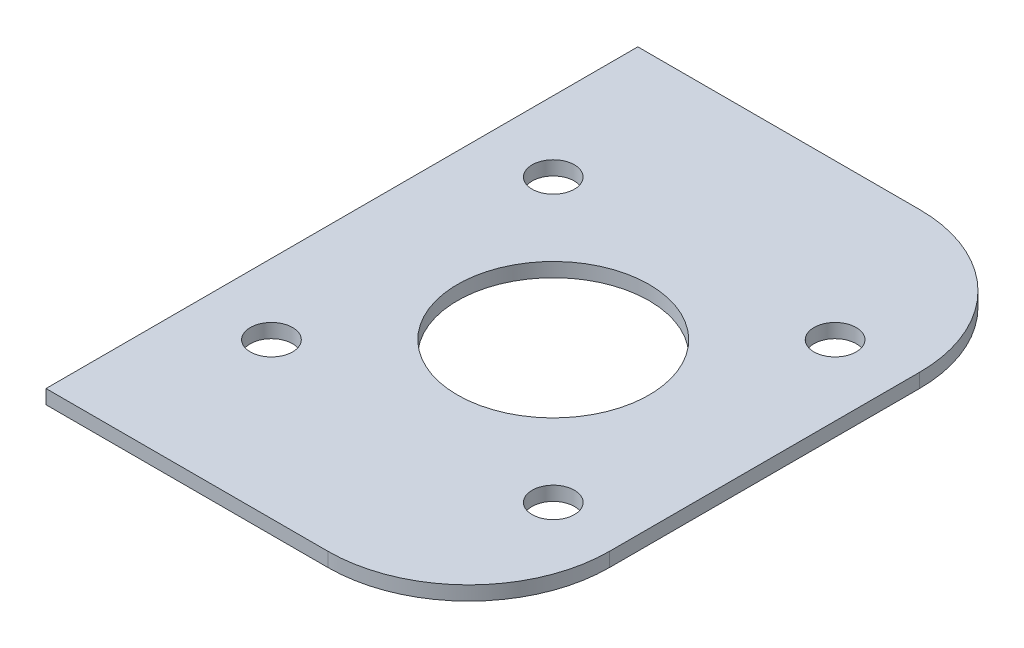
ISO-10303-21;
HEADER;
FILE_DESCRIPTION(('STEP AP214'),'2;1');
FILE_NAME('part.step','',(''),(''),'','','');
FILE_SCHEMA(('AUTOMOTIVE_DESIGN { 1 0 10303 214 1 1 1 1 }'));
ENDSEC;
DATA;
#1=APPLICATION_CONTEXT('core data for automotive mechanical design processes');
#2=APPLICATION_PROTOCOL_DEFINITION('international standard','automotive_design',2000,#1);
#3=PRODUCT_CONTEXT('',#1,'mechanical');
#4=PRODUCT('Part','Part','',(#3));
#5=PRODUCT_RELATED_PRODUCT_CATEGORY('part','',(#4));
#6=PRODUCT_DEFINITION_FORMATION('','',#4);
#7=PRODUCT_DEFINITION_CONTEXT('part definition',#1,'design');
#8=PRODUCT_DEFINITION('design','',#6,#7);
#9=PRODUCT_DEFINITION_SHAPE('','',#8);
#10=(LENGTH_UNIT() NAMED_UNIT(*) SI_UNIT(.MILLI.,.METRE.));
#11=(NAMED_UNIT(*) PLANE_ANGLE_UNIT() SI_UNIT($,.RADIAN.));
#12=(NAMED_UNIT(*) SI_UNIT($,.STERADIAN.) SOLID_ANGLE_UNIT());
#13=UNCERTAINTY_MEASURE_WITH_UNIT(LENGTH_MEASURE(1.E-05),#10,'distance_accuracy_value','');
#14=(GEOMETRIC_REPRESENTATION_CONTEXT(3) GLOBAL_UNCERTAINTY_ASSIGNED_CONTEXT((#13)) GLOBAL_UNIT_ASSIGNED_CONTEXT((#10,
#11,#12)) REPRESENTATION_CONTEXT('',''));
#15=CARTESIAN_POINT('',(0.,0.,0.));
#16=DIRECTION('',(0.,0.,1.));
#17=DIRECTION('',(1.,0.,0.));
#18=AXIS2_PLACEMENT_3D('',#15,#16,#17);
#19=CARTESIAN_POINT('',(0.,1.,0.));
#20=DIRECTION('',(0.,1.,0.));
#21=DIRECTION('',(0.,0.,1.));
#22=AXIS2_PLACEMENT_3D('',#19,#20,#21);
#23=PLANE('',#22);
#24=CARTESIAN_POINT('',(10.,1.,-10.));
#25=DIRECTION('',(0.,1.,0.));
#26=DIRECTION('',(0.,0.,1.));
#27=AXIS2_PLACEMENT_3D('',#24,#25,#26);
#28=CIRCLE('',#27,1.5);
#29=CARTESIAN_POINT('',(10.,1.,-8.5));
#30=VERTEX_POINT('',#29);
#31=EDGE_CURVE('E188',#30,#30,#28,.T.);
#32=ORIENTED_EDGE('',*,*,#31,.F.);
#33=EDGE_LOOP('',(#32));
#34=FACE_BOUND('',#33,.T.);
#35=CARTESIAN_POINT('',(10.,1.,10.));
#36=DIRECTION('',(0.,1.,0.));
#37=DIRECTION('',(0.,0.,1.));
#38=AXIS2_PLACEMENT_3D('',#35,#36,#37);
#39=CIRCLE('',#38,1.5);
#40=CARTESIAN_POINT('',(10.,1.,11.5));
#41=VERTEX_POINT('',#40);
#42=EDGE_CURVE('E194',#41,#41,#39,.T.);
#43=ORIENTED_EDGE('',*,*,#42,.F.);
#44=EDGE_LOOP('',(#43));
#45=FACE_BOUND('',#44,.T.);
#46=CARTESIAN_POINT('',(-10.,1.,10.));
#47=DIRECTION('',(0.,1.,0.));
#48=DIRECTION('',(0.,0.,1.));
#49=AXIS2_PLACEMENT_3D('',#46,#47,#48);
#50=CIRCLE('',#49,1.5);
#51=CARTESIAN_POINT('',(-10.,1.,11.5));
#52=VERTEX_POINT('',#51);
#53=EDGE_CURVE('E202',#52,#52,#50,.T.);
#54=ORIENTED_EDGE('',*,*,#53,.F.);
#55=EDGE_LOOP('',(#54));
#56=FACE_BOUND('',#55,.T.);
#57=CARTESIAN_POINT('',(-10.,1.,-10.));
#58=DIRECTION('',(0.,1.,0.));
#59=DIRECTION('',(0.,0.,1.));
#60=AXIS2_PLACEMENT_3D('',#57,#58,#59);
#61=CIRCLE('',#60,1.5);
#62=CARTESIAN_POINT('',(-10.,1.,-8.5));
#63=VERTEX_POINT('',#62);
#64=EDGE_CURVE('E191',#63,#63,#61,.T.);
#65=ORIENTED_EDGE('',*,*,#64,.F.);
#66=EDGE_LOOP('',(#65));
#67=FACE_BOUND('',#66,.T.);
#68=DIRECTION('',(0.,0.,-1.));
#69=VECTOR('',#68,1.);
#70=CARTESIAN_POINT('',(15.,1.,-21.));
#71=LINE('',#70,#69);
#72=CARTESIAN_POINT('',(15.,1.,11.));
#73=VERTEX_POINT('',#72);
#74=CARTESIAN_POINT('',(15.,1.,-11.));
#75=VERTEX_POINT('',#74);
#76=EDGE_CURVE('E96',#73,#75,#71,.T.);
#77=ORIENTED_EDGE('',*,*,#76,.T.);
#78=CARTESIAN_POINT('',(5.,1.,-11.));
#79=DIRECTION('',(0.,1.,0.));
#80=DIRECTION('',(0.,0.,1.));
#81=AXIS2_PLACEMENT_3D('',#78,#79,#80);
#82=CIRCLE('',#81,10.);
#83=CARTESIAN_POINT('',(5.,1.,-21.));
#84=VERTEX_POINT('',#83);
#85=EDGE_CURVE('E40',#75,#84,#82,.T.);
#86=ORIENTED_EDGE('',*,*,#85,.T.);
#87=DIRECTION('',(-1.,0.,0.));
#88=VECTOR('',#87,1.);
#89=CARTESIAN_POINT('',(-15.,1.,-21.));
#90=LINE('',#89,#88);
#91=CARTESIAN_POINT('',(-15.,1.,-21.));
#92=VERTEX_POINT('',#91);
#93=EDGE_CURVE('E86',#84,#92,#90,.T.);
#94=ORIENTED_EDGE('',*,*,#93,.T.);
#95=DIRECTION('',(0.,0.,1.));
#96=VECTOR('',#95,1.);
#97=CARTESIAN_POINT('',(-15.,1.,-21.));
#98=LINE('',#97,#96);
#99=CARTESIAN_POINT('',(-15.,1.,21.));
#100=VERTEX_POINT('',#99);
#101=EDGE_CURVE('E90',#92,#100,#98,.T.);
#102=ORIENTED_EDGE('',*,*,#101,.T.);
#103=DIRECTION('',(1.,0.,0.));
#104=VECTOR('',#103,1.);
#105=CARTESIAN_POINT('',(-15.,1.,21.));
#106=LINE('',#105,#104);
#107=CARTESIAN_POINT('',(5.,1.,21.));
#108=VERTEX_POINT('',#107);
#109=EDGE_CURVE('E110',#100,#108,#106,.T.);
#110=ORIENTED_EDGE('',*,*,#109,.T.);
#111=CARTESIAN_POINT('',(5.,1.,11.));
#112=DIRECTION('',(0.,1.,0.));
#113=DIRECTION('',(0.,0.,1.));
#114=AXIS2_PLACEMENT_3D('',#111,#112,#113);
#115=CIRCLE('',#114,10.);
#116=EDGE_CURVE('E133',#108,#73,#115,.T.);
#117=ORIENTED_EDGE('',*,*,#116,.T.);
#118=EDGE_LOOP('',(#77,#86,#94,#102,#110,#117));
#119=FACE_BOUND('',#118,.T.);
#120=CARTESIAN_POINT('',(0.,1.,0.));
#121=DIRECTION('',(0.,1.,0.));
#122=DIRECTION('',(0.,0.,1.));
#123=AXIS2_PLACEMENT_3D('',#120,#121,#122);
#124=CIRCLE('',#123,6.8);
#125=CARTESIAN_POINT('',(0.,1.,6.8));
#126=VERTEX_POINT('',#125);
#127=EDGE_CURVE('E117',#126,#126,#124,.T.);
#128=ORIENTED_EDGE('',*,*,#127,.F.);
#129=EDGE_LOOP('',(#128));
#130=FACE_BOUND('',#129,.T.);
#131=ADVANCED_FACE('F32',(#34,#45,#56,#67,#119,#130),#23,.T.);
#132=CARTESIAN_POINT('',(0.,0.,0.));
#133=DIRECTION('',(0.,1.,0.));
#134=DIRECTION('',(0.,0.,1.));
#135=AXIS2_PLACEMENT_3D('',#132,#133,#134);
#136=PLANE('',#135);
#137=CARTESIAN_POINT('',(10.,0.,-10.));
#138=DIRECTION('',(0.,1.,0.));
#139=DIRECTION('',(0.,0.,1.));
#140=AXIS2_PLACEMENT_3D('',#137,#138,#139);
#141=CIRCLE('',#140,1.5);
#142=CARTESIAN_POINT('',(10.,0.,-8.5));
#143=VERTEX_POINT('',#142);
#144=EDGE_CURVE('E186',#143,#143,#141,.T.);
#145=ORIENTED_EDGE('',*,*,#144,.T.);
#146=EDGE_LOOP('',(#145));
#147=FACE_BOUND('',#146,.T.);
#148=CARTESIAN_POINT('',(10.,0.,10.));
#149=DIRECTION('',(0.,1.,0.));
#150=DIRECTION('',(0.,0.,1.));
#151=AXIS2_PLACEMENT_3D('',#148,#149,#150);
#152=CIRCLE('',#151,1.5);
#153=CARTESIAN_POINT('',(10.,0.,11.5));
#154=VERTEX_POINT('',#153);
#155=EDGE_CURVE('E189',#154,#154,#152,.T.);
#156=ORIENTED_EDGE('',*,*,#155,.T.);
#157=EDGE_LOOP('',(#156));
#158=FACE_BOUND('',#157,.T.);
#159=CARTESIAN_POINT('',(-10.,0.,10.));
#160=DIRECTION('',(0.,1.,0.));
#161=DIRECTION('',(0.,0.,1.));
#162=AXIS2_PLACEMENT_3D('',#159,#160,#161);
#163=CIRCLE('',#162,1.5);
#164=CARTESIAN_POINT('',(-10.,0.,11.5));
#165=VERTEX_POINT('',#164);
#166=EDGE_CURVE('E199',#165,#165,#163,.T.);
#167=ORIENTED_EDGE('',*,*,#166,.T.);
#168=EDGE_LOOP('',(#167));
#169=FACE_BOUND('',#168,.T.);
#170=CARTESIAN_POINT('',(-10.,0.,-10.));
#171=DIRECTION('',(0.,1.,0.));
#172=DIRECTION('',(0.,0.,1.));
#173=AXIS2_PLACEMENT_3D('',#170,#171,#172);
#174=CIRCLE('',#173,1.5);
#175=CARTESIAN_POINT('',(-10.,0.,-8.5));
#176=VERTEX_POINT('',#175);
#177=EDGE_CURVE('E205',#176,#176,#174,.T.);
#178=ORIENTED_EDGE('',*,*,#177,.T.);
#179=EDGE_LOOP('',(#178));
#180=FACE_BOUND('',#179,.T.);
#181=DIRECTION('',(-1.,0.,0.));
#182=VECTOR('',#181,1.);
#183=CARTESIAN_POINT('',(-15.,0.,-21.));
#184=LINE('',#183,#182);
#185=CARTESIAN_POINT('',(5.,0.,-21.));
#186=VERTEX_POINT('',#185);
#187=CARTESIAN_POINT('',(-15.,0.,-21.));
#188=VERTEX_POINT('',#187);
#189=EDGE_CURVE('E102',#186,#188,#184,.T.);
#190=ORIENTED_EDGE('',*,*,#189,.F.);
#191=CARTESIAN_POINT('',(5.,0.,-11.));
#192=DIRECTION('',(0.,1.,0.));
#193=DIRECTION('',(0.,0.,1.));
#194=AXIS2_PLACEMENT_3D('',#191,#192,#193);
#195=CIRCLE('',#194,10.);
#196=CARTESIAN_POINT('',(15.,0.,-11.));
#197=VERTEX_POINT('',#196);
#198=EDGE_CURVE('E127',#186,#197,#195,.F.);
#199=ORIENTED_EDGE('',*,*,#198,.T.);
#200=DIRECTION('',(0.,0.,-1.));
#201=VECTOR('',#200,1.);
#202=CARTESIAN_POINT('',(15.,0.,-21.));
#203=LINE('',#202,#201);
#204=CARTESIAN_POINT('',(15.,0.,11.));
#205=VERTEX_POINT('',#204);
#206=EDGE_CURVE('E115',#205,#197,#203,.T.);
#207=ORIENTED_EDGE('',*,*,#206,.F.);
#208=CARTESIAN_POINT('',(5.,0.,11.));
#209=DIRECTION('',(0.,1.,0.));
#210=DIRECTION('',(0.,0.,1.));
#211=AXIS2_PLACEMENT_3D('',#208,#209,#210);
#212=CIRCLE('',#211,10.);
#213=CARTESIAN_POINT('',(5.,0.,21.));
#214=VERTEX_POINT('',#213);
#215=EDGE_CURVE('E125',#205,#214,#212,.F.);
#216=ORIENTED_EDGE('',*,*,#215,.T.);
#217=DIRECTION('',(1.,0.,0.));
#218=VECTOR('',#217,1.);
#219=CARTESIAN_POINT('',(-15.,0.,21.));
#220=LINE('',#219,#218);
#221=CARTESIAN_POINT('',(-15.,0.,21.));
#222=VERTEX_POINT('',#221);
#223=EDGE_CURVE('E121',#222,#214,#220,.T.);
#224=ORIENTED_EDGE('',*,*,#223,.F.);
#225=DIRECTION('',(0.,0.,1.));
#226=VECTOR('',#225,1.);
#227=CARTESIAN_POINT('',(-15.,0.,-21.));
#228=LINE('',#227,#226);
#229=EDGE_CURVE('E119',#188,#222,#228,.T.);
#230=ORIENTED_EDGE('',*,*,#229,.F.);
#231=EDGE_LOOP('',(#190,#199,#207,#216,#224,#230));
#232=FACE_BOUND('',#231,.T.);
#233=CARTESIAN_POINT('',(0.,0.,0.));
#234=DIRECTION('',(0.,1.,0.));
#235=DIRECTION('',(0.,0.,1.));
#236=AXIS2_PLACEMENT_3D('',#233,#234,#235);
#237=CIRCLE('',#236,6.8);
#238=CARTESIAN_POINT('',(0.,0.,6.8));
#239=VERTEX_POINT('',#238);
#240=EDGE_CURVE('E208',#239,#239,#237,.T.);
#241=ORIENTED_EDGE('',*,*,#240,.T.);
#242=EDGE_LOOP('',(#241));
#243=FACE_BOUND('',#242,.T.);
#244=ADVANCED_FACE('F141',(#147,#158,#169,#180,#232,#243),#136,.F.);
#245=CARTESIAN_POINT('',(15.,1.,-21.));
#246=DIRECTION('',(-1.,0.,0.));
#247=DIRECTION('',(0.,0.,1.));
#248=AXIS2_PLACEMENT_3D('',#245,#246,#247);
#249=PLANE('',#248);
#250=ORIENTED_EDGE('',*,*,#206,.T.);
#251=DIRECTION('',(0.,-1.,0.));
#252=VECTOR('',#251,1.);
#253=CARTESIAN_POINT('',(15.,1.,-11.));
#254=LINE('',#253,#252);
#255=EDGE_CURVE('E53',#197,#75,#254,.F.);
#256=ORIENTED_EDGE('',*,*,#255,.T.);
#257=ORIENTED_EDGE('',*,*,#76,.F.);
#258=DIRECTION('',(0.,-1.,0.));
#259=VECTOR('',#258,1.);
#260=CARTESIAN_POINT('',(15.,1.,11.));
#261=LINE('',#260,#259);
#262=EDGE_CURVE('E129',#73,#205,#261,.T.);
#263=ORIENTED_EDGE('',*,*,#262,.T.);
#264=EDGE_LOOP('',(#250,#256,#257,#263));
#265=FACE_BOUND('',#264,.T.);
#266=ADVANCED_FACE('F137',(#265),#249,.F.);
#267=CARTESIAN_POINT('',(-15.,1.,-21.));
#268=DIRECTION('',(0.,0.,1.));
#269=DIRECTION('',(1.,0.,0.));
#270=AXIS2_PLACEMENT_3D('',#267,#268,#269);
#271=PLANE('',#270);
#272=ORIENTED_EDGE('',*,*,#93,.F.);
#273=DIRECTION('',(0.,-1.,0.));
#274=VECTOR('',#273,1.);
#275=CARTESIAN_POINT('',(5.,1.,-21.));
#276=LINE('',#275,#274);
#277=EDGE_CURVE('E105',#84,#186,#276,.T.);
#278=ORIENTED_EDGE('',*,*,#277,.T.);
#279=ORIENTED_EDGE('',*,*,#189,.T.);
#280=DIRECTION('',(0.,-1.,0.));
#281=VECTOR('',#280,1.);
#282=CARTESIAN_POINT('',(-15.,1.,-21.));
#283=LINE('',#282,#281);
#284=EDGE_CURVE('E99',#92,#188,#283,.T.);
#285=ORIENTED_EDGE('',*,*,#284,.F.);
#286=EDGE_LOOP('',(#272,#278,#279,#285));
#287=FACE_BOUND('',#286,.T.);
#288=ADVANCED_FACE('F100',(#287),#271,.F.);
#289=CARTESIAN_POINT('',(-15.,1.,-21.));
#290=DIRECTION('',(1.,0.,0.));
#291=DIRECTION('',(0.,0.,-1.));
#292=AXIS2_PLACEMENT_3D('',#289,#290,#291);
#293=PLANE('',#292);
#294=ORIENTED_EDGE('',*,*,#229,.T.);
#295=DIRECTION('',(0.,-1.,0.));
#296=VECTOR('',#295,1.);
#297=CARTESIAN_POINT('',(-15.,1.,21.));
#298=LINE('',#297,#296);
#299=EDGE_CURVE('E106',#100,#222,#298,.T.);
#300=ORIENTED_EDGE('',*,*,#299,.F.);
#301=ORIENTED_EDGE('',*,*,#101,.F.);
#302=ORIENTED_EDGE('',*,*,#284,.T.);
#303=EDGE_LOOP('',(#294,#300,#301,#302));
#304=FACE_BOUND('',#303,.T.);
#305=ADVANCED_FACE('F108',(#304),#293,.F.);
#306=CARTESIAN_POINT('',(-15.,1.,21.));
#307=DIRECTION('',(0.,0.,-1.));
#308=DIRECTION('',(-1.,0.,0.));
#309=AXIS2_PLACEMENT_3D('',#306,#307,#308);
#310=PLANE('',#309);
#311=ORIENTED_EDGE('',*,*,#223,.T.);
#312=DIRECTION('',(0.,-1.,0.));
#313=VECTOR('',#312,1.);
#314=CARTESIAN_POINT('',(5.,1.,21.));
#315=LINE('',#314,#313);
#316=EDGE_CURVE('E11',#214,#108,#315,.F.);
#317=ORIENTED_EDGE('',*,*,#316,.T.);
#318=ORIENTED_EDGE('',*,*,#109,.F.);
#319=ORIENTED_EDGE('',*,*,#299,.T.);
#320=EDGE_LOOP('',(#311,#317,#318,#319));
#321=FACE_BOUND('',#320,.T.);
#322=ADVANCED_FACE('F143',(#321),#310,.F.);
#323=CARTESIAN_POINT('',(0.,1.,0.));
#324=DIRECTION('',(0.,-1.,0.));
#325=DIRECTION('',(0.,0.,-1.));
#326=AXIS2_PLACEMENT_3D('',#323,#324,#325);
#327=CYLINDRICAL_SURFACE('',#326,6.8);
#328=ORIENTED_EDGE('',*,*,#127,.T.);
#329=EDGE_LOOP('',(#328));
#330=FACE_BOUND('',#329,.T.);
#331=ORIENTED_EDGE('',*,*,#240,.F.);
#332=EDGE_LOOP('',(#331));
#333=FACE_BOUND('',#332,.T.);
#334=ADVANCED_FACE('F145',(#330,#333),#327,.F.);
#335=CARTESIAN_POINT('',(5.,1.,-11.));
#336=DIRECTION('',(0.,-1.,0.));
#337=DIRECTION('',(0.,0.,-1.));
#338=AXIS2_PLACEMENT_3D('',#335,#336,#337);
#339=CYLINDRICAL_SURFACE('',#338,10.);
#340=ORIENTED_EDGE('',*,*,#85,.F.);
#341=ORIENTED_EDGE('',*,*,#255,.F.);
#342=ORIENTED_EDGE('',*,*,#198,.F.);
#343=ORIENTED_EDGE('',*,*,#277,.F.);
#344=EDGE_LOOP('',(#340,#341,#342,#343));
#345=FACE_BOUND('',#344,.T.);
#346=ADVANCED_FACE('F151',(#345),#339,.T.);
#347=CARTESIAN_POINT('',(5.,1.,11.));
#348=DIRECTION('',(0.,-1.,0.));
#349=DIRECTION('',(0.,0.,-1.));
#350=AXIS2_PLACEMENT_3D('',#347,#348,#349);
#351=CYLINDRICAL_SURFACE('',#350,10.);
#352=ORIENTED_EDGE('',*,*,#116,.F.);
#353=ORIENTED_EDGE('',*,*,#316,.F.);
#354=ORIENTED_EDGE('',*,*,#215,.F.);
#355=ORIENTED_EDGE('',*,*,#262,.F.);
#356=EDGE_LOOP('',(#352,#353,#354,#355));
#357=FACE_BOUND('',#356,.T.);
#358=ADVANCED_FACE('F34',(#357),#351,.T.);
#359=CARTESIAN_POINT('',(-10.,0.,-10.));
#360=DIRECTION('',(0.,1.,0.));
#361=DIRECTION('',(0.,0.,1.));
#362=AXIS2_PLACEMENT_3D('',#359,#360,#361);
#363=CYLINDRICAL_SURFACE('',#362,1.5);
#364=ORIENTED_EDGE('',*,*,#177,.F.);
#365=EDGE_LOOP('',(#364));
#366=FACE_BOUND('',#365,.T.);
#367=ORIENTED_EDGE('',*,*,#64,.T.);
#368=EDGE_LOOP('',(#367));
#369=FACE_BOUND('',#368,.T.);
#370=ADVANCED_FACE('F166',(#366,#369),#363,.F.);
#371=CARTESIAN_POINT('',(-10.,0.,10.));
#372=DIRECTION('',(0.,1.,0.));
#373=DIRECTION('',(0.,0.,1.));
#374=AXIS2_PLACEMENT_3D('',#371,#372,#373);
#375=CYLINDRICAL_SURFACE('',#374,1.5);
#376=ORIENTED_EDGE('',*,*,#166,.F.);
#377=EDGE_LOOP('',(#376));
#378=FACE_BOUND('',#377,.T.);
#379=ORIENTED_EDGE('',*,*,#53,.T.);
#380=EDGE_LOOP('',(#379));
#381=FACE_BOUND('',#380,.T.);
#382=ADVANCED_FACE('F169',(#378,#381),#375,.F.);
#383=CARTESIAN_POINT('',(10.,0.,10.));
#384=DIRECTION('',(0.,1.,0.));
#385=DIRECTION('',(0.,0.,1.));
#386=AXIS2_PLACEMENT_3D('',#383,#384,#385);
#387=CYLINDRICAL_SURFACE('',#386,1.5);
#388=ORIENTED_EDGE('',*,*,#155,.F.);
#389=EDGE_LOOP('',(#388));
#390=FACE_BOUND('',#389,.T.);
#391=ORIENTED_EDGE('',*,*,#42,.T.);
#392=EDGE_LOOP('',(#391));
#393=FACE_BOUND('',#392,.T.);
#394=ADVANCED_FACE('F173',(#390,#393),#387,.F.);
#395=CARTESIAN_POINT('',(10.,0.,-10.));
#396=DIRECTION('',(0.,1.,0.));
#397=DIRECTION('',(0.,0.,1.));
#398=AXIS2_PLACEMENT_3D('',#395,#396,#397);
#399=CYLINDRICAL_SURFACE('',#398,1.5);
#400=ORIENTED_EDGE('',*,*,#144,.F.);
#401=EDGE_LOOP('',(#400));
#402=FACE_BOUND('',#401,.T.);
#403=ORIENTED_EDGE('',*,*,#31,.T.);
#404=EDGE_LOOP('',(#403));
#405=FACE_BOUND('',#404,.T.);
#406=ADVANCED_FACE('F177',(#402,#405),#399,.F.);
#407=CLOSED_SHELL('',(#131,#244,#266,#288,#305,#322,#334,#346,#358,#370,#382,#394,#406));
#408=MANIFOLD_SOLID_BREP('B2',#407);
#409=ADVANCED_BREP_SHAPE_REPRESENTATION('',(#18,#408),#14);
#410=SHAPE_DEFINITION_REPRESENTATION(#9,#409);
ENDSEC;
END-ISO-10303-21;
